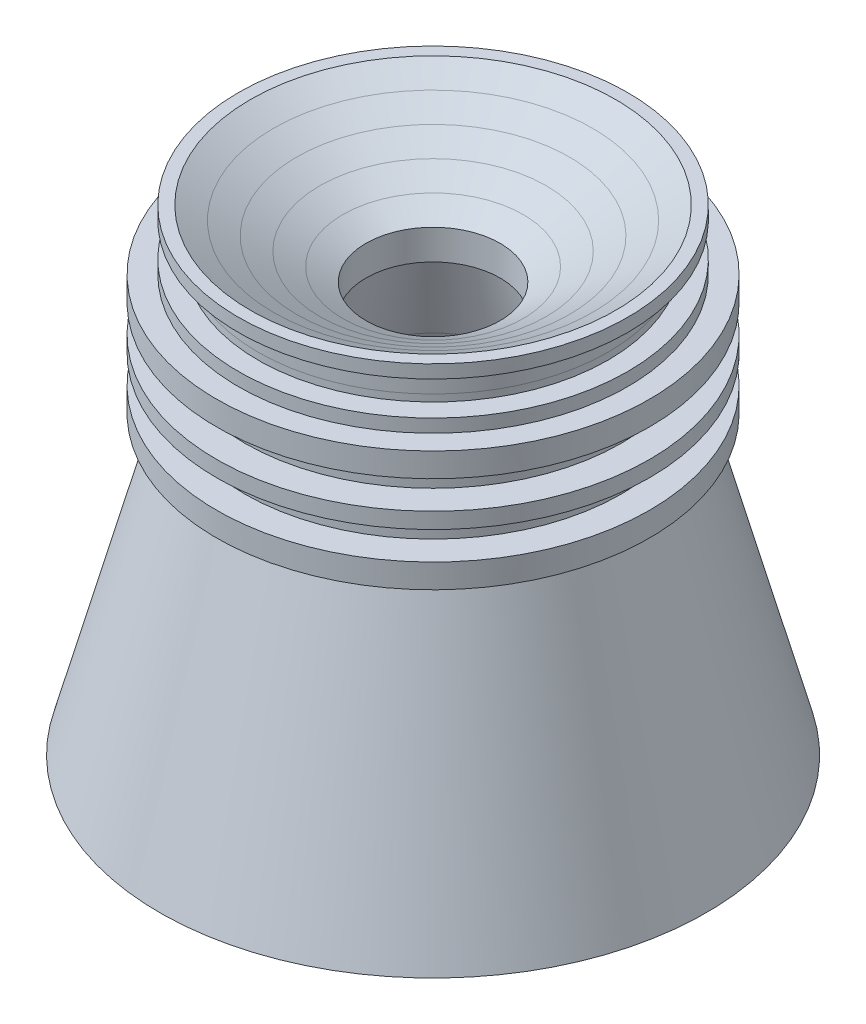
ISO-10303-21;
HEADER;
FILE_DESCRIPTION(('STEP AP214'),'2;1');
FILE_NAME('part.step','',(''),(''),'','','');
FILE_SCHEMA(('AUTOMOTIVE_DESIGN { 1 0 10303 214 1 1 1 1 }'));
ENDSEC;
DATA;
#1=APPLICATION_CONTEXT('core data for automotive mechanical design processes');
#2=APPLICATION_PROTOCOL_DEFINITION('international standard','automotive_design',2000,#1);
#3=PRODUCT_CONTEXT('',#1,'mechanical');
#4=PRODUCT('Part','Part','',(#3));
#5=PRODUCT_RELATED_PRODUCT_CATEGORY('part','',(#4));
#6=PRODUCT_DEFINITION_FORMATION('','',#4);
#7=PRODUCT_DEFINITION_CONTEXT('part definition',#1,'design');
#8=PRODUCT_DEFINITION('design','',#6,#7);
#9=PRODUCT_DEFINITION_SHAPE('','',#8);
#10=(LENGTH_UNIT() NAMED_UNIT(*) SI_UNIT(.MILLI.,.METRE.));
#11=(NAMED_UNIT(*) PLANE_ANGLE_UNIT() SI_UNIT($,.RADIAN.));
#12=(NAMED_UNIT(*) SI_UNIT($,.STERADIAN.) SOLID_ANGLE_UNIT());
#13=UNCERTAINTY_MEASURE_WITH_UNIT(LENGTH_MEASURE(1.E-05),#10,'distance_accuracy_value','');
#14=(GEOMETRIC_REPRESENTATION_CONTEXT(3) GLOBAL_UNCERTAINTY_ASSIGNED_CONTEXT((#13)) GLOBAL_UNIT_ASSIGNED_CONTEXT((#10,
#11,#12)) REPRESENTATION_CONTEXT('',''));
#15=CARTESIAN_POINT('',(0.,0.,0.));
#16=DIRECTION('',(0.,0.,1.));
#17=DIRECTION('',(1.,0.,0.));
#18=AXIS2_PLACEMENT_3D('',#15,#16,#17);
#19=CARTESIAN_POINT('',(0.,29.8728472820934,0.));
#20=DIRECTION('',(0.,-1.,0.));
#21=DIRECTION('',(1.,0.,0.));
#22=AXIS2_PLACEMENT_3D('',#19,#20,#21);
#23=CONICAL_SURFACE('',#22,14.1732,0.26179938779915);
#24=CARTESIAN_POINT('',(0.,-50.3229532912695,0.));
#25=DIRECTION('',(0.,1.,0.));
#26=DIRECTION('',(-1.,0.,0.));
#27=AXIS2_PLACEMENT_3D('',#24,#25,#26);
#28=CIRCLE('',#27,35.6616);
#29=CARTESIAN_POINT('',(-35.6616,-50.3229532912695,0.));
#30=VERTEX_POINT('',#29);
#31=EDGE_CURVE('E101',#30,#30,#28,.T.);
#32=ORIENTED_EDGE('',*,*,#31,.F.);
#33=EDGE_LOOP('',(#32));
#34=FACE_BOUND('',#33,.T.);
#35=CARTESIAN_POINT('',(0.,-34.2837262,0.));
#36=DIRECTION('',(0.,1.,0.));
#37=DIRECTION('',(0.,0.,1.));
#38=AXIS2_PLACEMENT_3D('',#35,#36,#37);
#39=CIRCLE('',#38,31.363902053675);
#40=CARTESIAN_POINT('',(0.,-34.2837262,31.363902053675));
#41=VERTEX_POINT('',#40);
#42=EDGE_CURVE('E10',#41,#41,#39,.F.);
#43=ORIENTED_EDGE('',*,*,#42,.F.);
#44=EDGE_LOOP('',(#43));
#45=FACE_BOUND('',#44,.T.);
#46=ADVANCED_FACE('F37',(#34,#45),#23,.F.);
#47=ORIENTED_EDGE('',*,*,#42,.T.);
#48=EDGE_LOOP('',(#47));
#49=FACE_BOUND('',#48,.T.);
#50=CARTESIAN_POINT('',(0.,-18.244566,0.));
#51=DIRECTION('',(0.,1.,0.));
#52=DIRECTION('',(0.,0.,1.));
#53=AXIS2_PLACEMENT_3D('',#50,#51,#52);
#54=CIRCLE('',#53,27.0662220308115);
#55=CARTESIAN_POINT('',(0.,-18.244566,27.0662220308115));
#56=VERTEX_POINT('',#55);
#57=EDGE_CURVE('E45',#56,#56,#54,.F.);
#58=ORIENTED_EDGE('',*,*,#57,.F.);
#59=EDGE_LOOP('',(#58));
#60=FACE_BOUND('',#59,.T.);
#61=ADVANCED_FACE('F181',(#49,#60),#23,.F.);
#62=ORIENTED_EDGE('',*,*,#57,.T.);
#63=EDGE_LOOP('',(#62));
#64=FACE_BOUND('',#63,.T.);
#65=CARTESIAN_POINT('',(0.,-2.2054058,0.));
#66=DIRECTION('',(0.,1.,0.));
#67=DIRECTION('',(0.,0.,1.));
#68=AXIS2_PLACEMENT_3D('',#65,#66,#67);
#69=CIRCLE('',#68,22.7685420079481);
#70=CARTESIAN_POINT('',(0.,-2.2054058,22.7685420079481));
#71=VERTEX_POINT('',#70);
#72=EDGE_CURVE('E52',#71,#71,#69,.F.);
#73=ORIENTED_EDGE('',*,*,#72,.F.);
#74=EDGE_LOOP('',(#73));
#75=FACE_BOUND('',#74,.T.);
#76=ADVANCED_FACE('F188',(#64,#75),#23,.F.);
#77=ORIENTED_EDGE('',*,*,#72,.T.);
#78=EDGE_LOOP('',(#77));
#79=FACE_BOUND('',#78,.T.);
#80=CARTESIAN_POINT('',(0.,13.8337544,0.));
#81=DIRECTION('',(0.,1.,0.));
#82=DIRECTION('',(-1.,0.,0.));
#83=AXIS2_PLACEMENT_3D('',#80,#81,#82);
#84=CIRCLE('',#83,18.4708619850847);
#85=CARTESIAN_POINT('',(-18.4708619850847,13.8337544,0.));
#86=VERTEX_POINT('',#85);
#87=EDGE_CURVE('E59',#86,#86,#84,.F.);
#88=ORIENTED_EDGE('',*,*,#87,.F.);
#89=EDGE_LOOP('',(#88));
#90=FACE_BOUND('',#89,.T.);
#91=ADVANCED_FACE('F196',(#79,#90),#23,.F.);
#92=CARTESIAN_POINT('',(0.,50.3229532912695,0.));
#93=DIRECTION('',(0.,1.,0.));
#94=DIRECTION('',(-1.,0.,0.));
#95=AXIS2_PLACEMENT_3D('',#92,#93,#94);
#96=CONICAL_SURFACE('',#95,38.5953,1.04719755119659);
#97=CARTESIAN_POINT('',(0.,36.2228472820934,0.));
#98=DIRECTION('',(0.,1.,0.));
#99=DIRECTION('',(-1.,0.,0.));
#100=AXIS2_PLACEMENT_3D('',#97,#98,#99);
#101=CIRCLE('',#100,14.1732);
#102=CARTESIAN_POINT('',(-14.1732,36.2228472820934,0.));
#103=VERTEX_POINT('',#102);
#104=EDGE_CURVE('E95',#103,#103,#101,.T.);
#105=ORIENTED_EDGE('',*,*,#104,.F.);
#106=EDGE_LOOP('',(#105));
#107=FACE_BOUND('',#106,.T.);
#108=CARTESIAN_POINT('',(0.,39.0429148912695,0.));
#109=DIRECTION('',(0.,1.,0.));
#110=DIRECTION('',(0.,0.,1.));
#111=AXIS2_PLACEMENT_3D('',#108,#109,#110);
#112=CIRCLE('',#111,19.0577003798722);
#113=CARTESIAN_POINT('',(0.,39.0429148912695,19.0577003798722));
#114=VERTEX_POINT('',#113);
#115=EDGE_CURVE('E65',#114,#114,#112,.F.);
#116=ORIENTED_EDGE('',*,*,#115,.F.);
#117=EDGE_LOOP('',(#116));
#118=FACE_BOUND('',#117,.T.);
#119=ADVANCED_FACE('F177',(#107,#118),#96,.F.);
#120=CARTESIAN_POINT('',(0.,37.6229532912695,0.));
#121=DIRECTION('',(0.,-1.,0.));
#122=DIRECTION('',(1.,0.,0.));
#123=AXIS2_PLACEMENT_3D('',#120,#121,#122);
#124=CYLINDRICAL_SURFACE('',#123,36.9824);
#125=CARTESIAN_POINT('',(0.,40.4042532912695,0.));
#126=DIRECTION('',(0.,-1.,0.));
#127=DIRECTION('',(1.,0.,0.));
#128=AXIS2_PLACEMENT_3D('',#125,#126,#127);
#129=CIRCLE('',#128,36.9824);
#130=CARTESIAN_POINT('',(36.9824,40.4042532912695,0.));
#131=VERTEX_POINT('',#130);
#132=EDGE_CURVE('E150',#131,#131,#129,.T.);
#133=ORIENTED_EDGE('',*,*,#132,.F.);
#134=EDGE_LOOP('',(#133));
#135=FACE_BOUND('',#134,.T.);
#136=CARTESIAN_POINT('',(0.,41.8629244912695,0.));
#137=DIRECTION('',(0.,1.,0.));
#138=DIRECTION('',(0.,0.,1.));
#139=AXIS2_PLACEMENT_3D('',#136,#137,#138);
#140=CIRCLE('',#139,36.9824);
#141=CARTESIAN_POINT('',(0.,41.8629244912695,36.9824));
#142=VERTEX_POINT('',#141);
#143=EDGE_CURVE('E69',#142,#142,#140,.T.);
#144=ORIENTED_EDGE('',*,*,#143,.F.);
#145=EDGE_LOOP('',(#144));
#146=FACE_BOUND('',#145,.T.);
#147=ADVANCED_FACE('F211',(#135,#146),#124,.T.);
#148=ORIENTED_EDGE('',*,*,#115,.T.);
#149=EDGE_LOOP('',(#148));
#150=FACE_BOUND('',#149,.T.);
#151=CARTESIAN_POINT('',(0.,41.8629244912695,0.));
#152=DIRECTION('',(0.,1.,0.));
#153=DIRECTION('',(0.,0.,1.));
#154=AXIS2_PLACEMENT_3D('',#151,#152,#153);
#155=CIRCLE('',#154,23.9421002849042);
#156=CARTESIAN_POINT('',(0.,41.8629244912695,23.9421002849042));
#157=VERTEX_POINT('',#156);
#158=EDGE_CURVE('E70',#157,#157,#155,.F.);
#159=ORIENTED_EDGE('',*,*,#158,.F.);
#160=EDGE_LOOP('',(#159));
#161=FACE_BOUND('',#160,.T.);
#162=ADVANCED_FACE('F213',(#150,#161),#96,.F.);
#163=ORIENTED_EDGE('',*,*,#143,.T.);
#164=EDGE_LOOP('',(#163));
#165=FACE_BOUND('',#164,.T.);
#166=CARTESIAN_POINT('',(0.,44.6829340912695,0.));
#167=DIRECTION('',(0.,1.,0.));
#168=DIRECTION('',(0.,0.,1.));
#169=AXIS2_PLACEMENT_3D('',#166,#167,#168);
#170=CIRCLE('',#169,36.9824);
#171=CARTESIAN_POINT('',(0.,44.6829340912695,36.9824));
#172=VERTEX_POINT('',#171);
#173=EDGE_CURVE('E74',#172,#172,#170,.T.);
#174=ORIENTED_EDGE('',*,*,#173,.F.);
#175=EDGE_LOOP('',(#174));
#176=FACE_BOUND('',#175,.T.);
#177=ADVANCED_FACE('F267',(#165,#176),#124,.T.);
#178=ORIENTED_EDGE('',*,*,#158,.T.);
#179=EDGE_LOOP('',(#178));
#180=FACE_BOUND('',#179,.T.);
#181=CARTESIAN_POINT('',(0.,44.6829340912695,0.));
#182=DIRECTION('',(0.,1.,0.));
#183=DIRECTION('',(0.,0.,1.));
#184=AXIS2_PLACEMENT_3D('',#181,#182,#183);
#185=CIRCLE('',#184,28.8265001899361);
#186=CARTESIAN_POINT('',(0.,44.6829340912695,28.8265001899361));
#187=VERTEX_POINT('',#186);
#188=EDGE_CURVE('E78',#187,#187,#185,.F.);
#189=ORIENTED_EDGE('',*,*,#188,.F.);
#190=EDGE_LOOP('',(#189));
#191=FACE_BOUND('',#190,.T.);
#192=ADVANCED_FACE('F278',(#180,#191),#96,.F.);
#193=ORIENTED_EDGE('',*,*,#188,.T.);
#194=EDGE_LOOP('',(#193));
#195=FACE_BOUND('',#194,.T.);
#196=CARTESIAN_POINT('',(0.,47.5029436912695,0.));
#197=DIRECTION('',(0.,1.,0.));
#198=DIRECTION('',(0.,0.,1.));
#199=AXIS2_PLACEMENT_3D('',#196,#197,#198);
#200=CIRCLE('',#199,33.7109000949681);
#201=CARTESIAN_POINT('',(0.,47.5029436912695,33.7109000949681));
#202=VERTEX_POINT('',#201);
#203=EDGE_CURVE('E82',#202,#202,#200,.F.);
#204=ORIENTED_EDGE('',*,*,#203,.F.);
#205=EDGE_LOOP('',(#204));
#206=FACE_BOUND('',#205,.T.);
#207=ADVANCED_FACE('F178',(#195,#206),#96,.F.);
#208=CARTESIAN_POINT('',(0.,50.3229532912695,0.));
#209=DIRECTION('',(0.,1.,0.));
#210=DIRECTION('',(-1.,0.,0.));
#211=AXIS2_PLACEMENT_3D('',#208,#209,#210);
#212=CYLINDRICAL_SURFACE('',#211,45.7326999999999);
#213=CARTESIAN_POINT('',(0.,12.2229532912695,0.));
#214=DIRECTION('',(0.,1.,0.));
#215=DIRECTION('',(-1.,0.,0.));
#216=AXIS2_PLACEMENT_3D('',#213,#214,#215);
#217=CIRCLE('',#216,45.7326999999999);
#218=CARTESIAN_POINT('',(-45.7326999999999,12.2229532912695,0.));
#219=VERTEX_POINT('',#218);
#220=EDGE_CURVE('E113',#219,#219,#217,.T.);
#221=ORIENTED_EDGE('',*,*,#220,.T.);
#222=EDGE_LOOP('',(#221));
#223=FACE_BOUND('',#222,.T.);
#224=CARTESIAN_POINT('',(0.,17.3029532912695,0.));
#225=DIRECTION('',(0.,-1.,0.));
#226=DIRECTION('',(1.,0.,0.));
#227=AXIS2_PLACEMENT_3D('',#224,#225,#226);
#228=CIRCLE('',#227,45.7326999999999);
#229=CARTESIAN_POINT('',(45.7326999999999,17.3029532912695,0.));
#230=VERTEX_POINT('',#229);
#231=EDGE_CURVE('E133',#230,#230,#228,.T.);
#232=ORIENTED_EDGE('',*,*,#231,.T.);
#233=EDGE_LOOP('',(#232));
#234=FACE_BOUND('',#233,.T.);
#235=ADVANCED_FACE('F164',(#223,#234),#212,.T.);
#236=CARTESIAN_POINT('',(0.,50.3229532912695,0.));
#237=DIRECTION('',(0.,1.,0.));
#238=DIRECTION('',(-1.,0.,0.));
#239=AXIS2_PLACEMENT_3D('',#236,#237,#238);
#240=CYLINDRICAL_SURFACE('',#239,41.1353);
#241=CARTESIAN_POINT('',(0.,47.5416532912695,0.));
#242=DIRECTION('',(0.,-1.,0.));
#243=DIRECTION('',(1.,0.,0.));
#244=AXIS2_PLACEMENT_3D('',#241,#242,#243);
#245=CIRCLE('',#244,41.1353);
#246=CARTESIAN_POINT('',(41.1353,47.5416532912695,0.));
#247=VERTEX_POINT('',#246);
#248=EDGE_CURVE('E139',#247,#247,#245,.T.);
#249=ORIENTED_EDGE('',*,*,#248,.F.);
#250=EDGE_LOOP('',(#249));
#251=FACE_BOUND('',#250,.T.);
#252=CARTESIAN_POINT('',(0.,50.3229532912695,0.));
#253=DIRECTION('',(0.,1.,0.));
#254=DIRECTION('',(-1.,0.,0.));
#255=AXIS2_PLACEMENT_3D('',#252,#253,#254);
#256=CIRCLE('',#255,41.1353);
#257=CARTESIAN_POINT('',(-41.1353,50.3229532912695,0.));
#258=VERTEX_POINT('',#257);
#259=EDGE_CURVE('E89',#258,#258,#256,.T.);
#260=ORIENTED_EDGE('',*,*,#259,.F.);
#261=EDGE_LOOP('',(#260));
#262=FACE_BOUND('',#261,.T.);
#263=ADVANCED_FACE('F39',(#251,#262),#240,.T.);
#264=CARTESIAN_POINT('',(41.1353,50.3229532912695,0.));
#265=DIRECTION('',(0.,-1.,0.));
#266=DIRECTION('',(1.,0.,0.));
#267=AXIS2_PLACEMENT_3D('',#264,#265,#266);
#268=PLANE('',#267);
#269=CARTESIAN_POINT('',(0.,50.3229532912695,0.));
#270=DIRECTION('',(0.,1.,0.));
#271=DIRECTION('',(-1.,0.,0.));
#272=AXIS2_PLACEMENT_3D('',#269,#270,#271);
#273=CIRCLE('',#272,38.5953);
#274=CARTESIAN_POINT('',(-38.5953,50.3229532912695,0.));
#275=VERTEX_POINT('',#274);
#276=EDGE_CURVE('E92',#275,#275,#273,.T.);
#277=ORIENTED_EDGE('',*,*,#276,.F.);
#278=EDGE_LOOP('',(#277));
#279=FACE_BOUND('',#278,.T.);
#280=ORIENTED_EDGE('',*,*,#259,.T.);
#281=EDGE_LOOP('',(#280));
#282=FACE_BOUND('',#281,.T.);
#283=ADVANCED_FACE('F163',(#279,#282),#268,.F.);
#284=ORIENTED_EDGE('',*,*,#203,.T.);
#285=EDGE_LOOP('',(#284));
#286=FACE_BOUND('',#285,.T.);
#287=ORIENTED_EDGE('',*,*,#276,.T.);
#288=EDGE_LOOP('',(#287));
#289=FACE_BOUND('',#288,.T.);
#290=ADVANCED_FACE('F169',(#286,#289),#96,.F.);
#291=CARTESIAN_POINT('',(0.,50.3229532912695,0.));
#292=DIRECTION('',(0.,1.,0.));
#293=DIRECTION('',(-1.,0.,0.));
#294=AXIS2_PLACEMENT_3D('',#291,#292,#293);
#295=CYLINDRICAL_SURFACE('',#294,14.1732);
#296=CARTESIAN_POINT('',(0.,29.8728472820934,0.));
#297=DIRECTION('',(0.,1.,0.));
#298=DIRECTION('',(-1.,0.,0.));
#299=AXIS2_PLACEMENT_3D('',#296,#297,#298);
#300=CIRCLE('',#299,14.1732);
#301=CARTESIAN_POINT('',(-14.1732,29.8728472820934,0.));
#302=VERTEX_POINT('',#301);
#303=EDGE_CURVE('E98',#302,#302,#300,.T.);
#304=ORIENTED_EDGE('',*,*,#303,.F.);
#305=EDGE_LOOP('',(#304));
#306=FACE_BOUND('',#305,.T.);
#307=ORIENTED_EDGE('',*,*,#104,.T.);
#308=EDGE_LOOP('',(#307));
#309=FACE_BOUND('',#308,.T.);
#310=ADVANCED_FACE('F174',(#306,#309),#295,.F.);
#311=ORIENTED_EDGE('',*,*,#87,.T.);
#312=EDGE_LOOP('',(#311));
#313=FACE_BOUND('',#312,.T.);
#314=ORIENTED_EDGE('',*,*,#303,.T.);
#315=EDGE_LOOP('',(#314));
#316=FACE_BOUND('',#315,.T.);
#317=ADVANCED_FACE('F184',(#313,#316),#23,.F.);
#318=CARTESIAN_POINT('',(57.7596,-50.3229532912695,0.));
#319=DIRECTION('',(0.,1.,0.));
#320=DIRECTION('',(-1.,0.,0.));
#321=AXIS2_PLACEMENT_3D('',#318,#319,#320);
#322=PLANE('',#321);
#323=CARTESIAN_POINT('',(0.,-50.3229532912695,0.));
#324=DIRECTION('',(0.,1.,0.));
#325=DIRECTION('',(-1.,0.,0.));
#326=AXIS2_PLACEMENT_3D('',#323,#324,#325);
#327=CIRCLE('',#326,57.7596);
#328=CARTESIAN_POINT('',(-57.7596,-50.3229532912695,0.));
#329=VERTEX_POINT('',#328);
#330=EDGE_CURVE('E104',#329,#329,#327,.T.);
#331=ORIENTED_EDGE('',*,*,#330,.F.);
#332=EDGE_LOOP('',(#331));
#333=FACE_BOUND('',#332,.T.);
#334=ORIENTED_EDGE('',*,*,#31,.T.);
#335=EDGE_LOOP('',(#334));
#336=FACE_BOUND('',#335,.T.);
#337=ADVANCED_FACE('F194',(#333,#336),#322,.F.);
#338=CARTESIAN_POINT('',(0.,-50.3229532912695,0.));
#339=DIRECTION('',(0.,-1.,0.));
#340=DIRECTION('',(1.,0.,0.));
#341=AXIS2_PLACEMENT_3D('',#338,#339,#340);
#342=CONICAL_SURFACE('',#341,57.7596,0.26179938779915);
#343=CARTESIAN_POINT('',(0.,11.9713661201337,0.));
#344=DIRECTION('',(0.,1.,0.));
#345=DIRECTION('',(-1.,0.,0.));
#346=AXIS2_PLACEMENT_3D('',#343,#344,#345);
#347=CIRCLE('',#346,41.0678874206681);
#348=CARTESIAN_POINT('',(-41.0678874206681,11.9713661201337,0.));
#349=VERTEX_POINT('',#348);
#350=EDGE_CURVE('E107',#349,#349,#347,.T.);
#351=ORIENTED_EDGE('',*,*,#350,.F.);
#352=EDGE_LOOP('',(#351));
#353=FACE_BOUND('',#352,.T.);
#354=ORIENTED_EDGE('',*,*,#330,.T.);
#355=EDGE_LOOP('',(#354));
#356=FACE_BOUND('',#355,.T.);
#357=ADVANCED_FACE('F201',(#353,#356),#342,.T.);
#358=CARTESIAN_POINT('',(0.,11.9713661201337,0.));
#359=DIRECTION('',(0.,1.,0.));
#360=DIRECTION('',(-1.,0.,0.));
#361=AXIS2_PLACEMENT_3D('',#358,#359,#360);
#362=CONICAL_SURFACE('',#361,41.0678874206681,0.261799387799139);
#363=CARTESIAN_POINT('',(0.,12.2229532912695,0.));
#364=DIRECTION('',(0.,1.,0.));
#365=DIRECTION('',(-1.,0.,0.));
#366=AXIS2_PLACEMENT_3D('',#363,#364,#365);
#367=CIRCLE('',#366,41.1352999999999);
#368=CARTESIAN_POINT('',(-41.1352999999999,12.2229532912695,0.));
#369=VERTEX_POINT('',#368);
#370=EDGE_CURVE('E110',#369,#369,#367,.T.);
#371=ORIENTED_EDGE('',*,*,#370,.F.);
#372=EDGE_LOOP('',(#371));
#373=FACE_BOUND('',#372,.T.);
#374=ORIENTED_EDGE('',*,*,#350,.T.);
#375=EDGE_LOOP('',(#374));
#376=FACE_BOUND('',#375,.T.);
#377=ADVANCED_FACE('F447',(#373,#376),#362,.T.);
#378=CARTESIAN_POINT('',(41.1352999999999,12.2229532912695,0.));
#379=DIRECTION('',(0.,1.,0.));
#380=DIRECTION('',(-1.,0.,0.));
#381=AXIS2_PLACEMENT_3D('',#378,#379,#380);
#382=PLANE('',#381);
#383=ORIENTED_EDGE('',*,*,#220,.F.);
#384=EDGE_LOOP('',(#383));
#385=FACE_BOUND('',#384,.T.);
#386=ORIENTED_EDGE('',*,*,#370,.T.);
#387=EDGE_LOOP('',(#386));
#388=FACE_BOUND('',#387,.T.);
#389=ADVANCED_FACE('F389',(#385,#388),#382,.F.);
#390=CARTESIAN_POINT('',(45.7326999999999,17.3029532912695,0.));
#391=DIRECTION('',(0.,1.,0.));
#392=DIRECTION('',(-1.,0.,0.));
#393=AXIS2_PLACEMENT_3D('',#390,#391,#392);
#394=PLANE('',#393);
#395=CARTESIAN_POINT('',(0.,17.3029532912695,0.));
#396=DIRECTION('',(0.,-1.,0.));
#397=DIRECTION('',(1.,0.,0.));
#398=AXIS2_PLACEMENT_3D('',#395,#396,#397);
#399=CIRCLE('',#398,39.7915262033108);
#400=CARTESIAN_POINT('',(39.7915262033108,17.3029532912695,0.));
#401=VERTEX_POINT('',#400);
#402=EDGE_CURVE('E130',#401,#401,#399,.T.);
#403=ORIENTED_EDGE('',*,*,#402,.T.);
#404=EDGE_LOOP('',(#403));
#405=FACE_BOUND('',#404,.T.);
#406=ORIENTED_EDGE('',*,*,#231,.F.);
#407=EDGE_LOOP('',(#406));
#408=FACE_BOUND('',#407,.T.);
#409=ADVANCED_FACE('F379',(#405,#408),#394,.T.);
#410=CARTESIAN_POINT('',(0.,37.6229532912695,0.));
#411=DIRECTION('',(0.,-1.,0.));
#412=DIRECTION('',(1.,0.,0.));
#413=AXIS2_PLACEMENT_3D('',#410,#411,#412);
#414=CYLINDRICAL_SURFACE('',#413,39.7915262033108);
#415=ORIENTED_EDGE('',*,*,#402,.F.);
#416=EDGE_LOOP('',(#415));
#417=FACE_BOUND('',#416,.T.);
#418=CARTESIAN_POINT('',(0.,23.2441270879586,0.));
#419=DIRECTION('',(0.,-1.,0.));
#420=DIRECTION('',(1.,0.,0.));
#421=AXIS2_PLACEMENT_3D('',#418,#419,#420);
#422=CIRCLE('',#421,39.7915262033108);
#423=CARTESIAN_POINT('',(39.7915262033108,23.2441270879586,0.));
#424=VERTEX_POINT('',#423);
#425=EDGE_CURVE('E127',#424,#424,#422,.T.);
#426=ORIENTED_EDGE('',*,*,#425,.T.);
#427=EDGE_LOOP('',(#426));
#428=FACE_BOUND('',#427,.T.);
#429=ADVANCED_FACE('F369',(#417,#428),#414,.T.);
#430=CARTESIAN_POINT('',(45.7326999999999,23.2441270879586,0.));
#431=DIRECTION('',(0.,1.,0.));
#432=DIRECTION('',(-1.,0.,0.));
#433=AXIS2_PLACEMENT_3D('',#430,#431,#432);
#434=PLANE('',#433);
#435=ORIENTED_EDGE('',*,*,#425,.F.);
#436=EDGE_LOOP('',(#435));
#437=FACE_BOUND('',#436,.T.);
#438=CARTESIAN_POINT('',(0.,23.2441270879586,0.));
#439=DIRECTION('',(0.,-1.,0.));
#440=DIRECTION('',(1.,0.,0.));
#441=AXIS2_PLACEMENT_3D('',#438,#439,#440);
#442=CIRCLE('',#441,45.7326999999999);
#443=CARTESIAN_POINT('',(45.7326999999999,23.2441270879586,0.));
#444=VERTEX_POINT('',#443);
#445=EDGE_CURVE('E123',#444,#444,#442,.T.);
#446=ORIENTED_EDGE('',*,*,#445,.T.);
#447=EDGE_LOOP('',(#446));
#448=FACE_BOUND('',#447,.T.);
#449=ADVANCED_FACE('F359',(#437,#448),#434,.F.);
#450=CARTESIAN_POINT('',(0.,47.5416532912695,0.));
#451=DIRECTION('',(0.,1.,0.));
#452=DIRECTION('',(-1.,0.,0.));
#453=AXIS2_PLACEMENT_3D('',#450,#451,#452);
#454=PLANE('',#453);
#455=CARTESIAN_POINT('',(0.,47.5416532912695,0.));
#456=DIRECTION('',(0.,-1.,0.));
#457=DIRECTION('',(1.,0.,0.));
#458=AXIS2_PLACEMENT_3D('',#455,#456,#457);
#459=CIRCLE('',#458,36.9824);
#460=CARTESIAN_POINT('',(36.9824,47.5416532912695,0.));
#461=VERTEX_POINT('',#460);
#462=EDGE_CURVE('E122',#461,#461,#459,.T.);
#463=ORIENTED_EDGE('',*,*,#462,.F.);
#464=EDGE_LOOP('',(#463));
#465=FACE_BOUND('',#464,.T.);
#466=ORIENTED_EDGE('',*,*,#248,.T.);
#467=EDGE_LOOP('',(#466));
#468=FACE_BOUND('',#467,.T.);
#469=ADVANCED_FACE('F159',(#465,#468),#454,.F.);
#470=ORIENTED_EDGE('',*,*,#173,.T.);
#471=EDGE_LOOP('',(#470));
#472=FACE_BOUND('',#471,.T.);
#473=ORIENTED_EDGE('',*,*,#462,.T.);
#474=EDGE_LOOP('',(#473));
#475=FACE_BOUND('',#474,.T.);
#476=ADVANCED_FACE('F268',(#472,#475),#124,.T.);
#477=CARTESIAN_POINT('',(0.,40.4042532912695,0.));
#478=DIRECTION('',(0.,1.,0.));
#479=DIRECTION('',(-1.,0.,0.));
#480=AXIS2_PLACEMENT_3D('',#477,#478,#479);
#481=PLANE('',#480);
#482=ORIENTED_EDGE('',*,*,#132,.T.);
#483=EDGE_LOOP('',(#482));
#484=FACE_BOUND('',#483,.T.);
#485=CARTESIAN_POINT('',(0.,40.4042532912695,0.));
#486=DIRECTION('',(0.,-1.,0.));
#487=DIRECTION('',(1.,0.,0.));
#488=AXIS2_PLACEMENT_3D('',#485,#486,#487);
#489=CIRCLE('',#488,41.1353);
#490=CARTESIAN_POINT('',(41.1353,40.4042532912695,0.));
#491=VERTEX_POINT('',#490);
#492=EDGE_CURVE('E153',#491,#491,#489,.T.);
#493=ORIENTED_EDGE('',*,*,#492,.F.);
#494=EDGE_LOOP('',(#493));
#495=FACE_BOUND('',#494,.T.);
#496=ADVANCED_FACE('F340',(#484,#495),#481,.T.);
#497=ORIENTED_EDGE('',*,*,#445,.F.);
#498=EDGE_LOOP('',(#497));
#499=FACE_BOUND('',#498,.T.);
#500=CARTESIAN_POINT('',(0.,26.6017794945803,0.));
#501=DIRECTION('',(0.,-1.,0.));
#502=DIRECTION('',(1.,0.,0.));
#503=AXIS2_PLACEMENT_3D('',#500,#501,#502);
#504=CIRCLE('',#503,45.7327);
#505=CARTESIAN_POINT('',(45.7327,26.6017794945803,0.));
#506=VERTEX_POINT('',#505);
#507=EDGE_CURVE('E140',#506,#506,#504,.T.);
#508=ORIENTED_EDGE('',*,*,#507,.T.);
#509=EDGE_LOOP('',(#508));
#510=FACE_BOUND('',#509,.T.);
#511=ADVANCED_FACE('F334',(#499,#510),#212,.T.);
#512=CARTESIAN_POINT('',(0.,32.5429532912695,0.));
#513=DIRECTION('',(0.,1.,0.));
#514=DIRECTION('',(-1.,0.,0.));
#515=AXIS2_PLACEMENT_3D('',#512,#513,#514);
#516=PLANE('',#515);
#517=CARTESIAN_POINT('',(0.,32.5429532912695,0.));
#518=DIRECTION('',(0.,-1.,0.));
#519=DIRECTION('',(1.,0.,0.));
#520=AXIS2_PLACEMENT_3D('',#517,#518,#519);
#521=CIRCLE('',#520,39.7915262033108);
#522=CARTESIAN_POINT('',(39.7915262033108,32.5429532912695,0.));
#523=VERTEX_POINT('',#522);
#524=EDGE_CURVE('E126',#523,#523,#521,.T.);
#525=ORIENTED_EDGE('',*,*,#524,.F.);
#526=EDGE_LOOP('',(#525));
#527=FACE_BOUND('',#526,.T.);
#528=CARTESIAN_POINT('',(0.,32.5429532912695,0.));
#529=DIRECTION('',(0.,-1.,0.));
#530=DIRECTION('',(1.,0.,0.));
#531=AXIS2_PLACEMENT_3D('',#528,#529,#530);
#532=CIRCLE('',#531,45.7326999999999);
#533=CARTESIAN_POINT('',(45.7326999999999,32.5429532912695,0.));
#534=VERTEX_POINT('',#533);
#535=EDGE_CURVE('E136',#534,#534,#532,.T.);
#536=ORIENTED_EDGE('',*,*,#535,.T.);
#537=EDGE_LOOP('',(#536));
#538=FACE_BOUND('',#537,.T.);
#539=ADVANCED_FACE('F324',(#527,#538),#516,.F.);
#540=CARTESIAN_POINT('',(0.,26.6017794945803,0.));
#541=DIRECTION('',(0.,1.,0.));
#542=DIRECTION('',(-1.,0.,0.));
#543=AXIS2_PLACEMENT_3D('',#540,#541,#542);
#544=PLANE('',#543);
#545=CARTESIAN_POINT('',(0.,26.6017794945803,0.));
#546=DIRECTION('',(0.,-1.,0.));
#547=DIRECTION('',(1.,0.,0.));
#548=AXIS2_PLACEMENT_3D('',#545,#546,#547);
#549=CIRCLE('',#548,39.7915262033108);
#550=CARTESIAN_POINT('',(39.7915262033108,26.6017794945803,0.));
#551=VERTEX_POINT('',#550);
#552=EDGE_CURVE('E143',#551,#551,#549,.T.);
#553=ORIENTED_EDGE('',*,*,#552,.T.);
#554=EDGE_LOOP('',(#553));
#555=FACE_BOUND('',#554,.T.);
#556=ORIENTED_EDGE('',*,*,#507,.F.);
#557=EDGE_LOOP('',(#556));
#558=FACE_BOUND('',#557,.T.);
#559=ADVANCED_FACE('F313',(#555,#558),#544,.T.);
#560=CARTESIAN_POINT('',(0.,37.6229532912695,0.));
#561=DIRECTION('',(0.,-1.,0.));
#562=DIRECTION('',(1.,0.,0.));
#563=AXIS2_PLACEMENT_3D('',#560,#561,#562);
#564=CYLINDRICAL_SURFACE('',#563,39.7915262033108);
#565=ORIENTED_EDGE('',*,*,#552,.F.);
#566=EDGE_LOOP('',(#565));
#567=FACE_BOUND('',#566,.T.);
#568=ORIENTED_EDGE('',*,*,#524,.T.);
#569=EDGE_LOOP('',(#568));
#570=FACE_BOUND('',#569,.T.);
#571=ADVANCED_FACE('F308',(#567,#570),#564,.T.);
#572=CARTESIAN_POINT('',(0.,37.6229532912695,0.));
#573=DIRECTION('',(0.,1.,0.));
#574=DIRECTION('',(-1.,0.,0.));
#575=AXIS2_PLACEMENT_3D('',#572,#573,#574);
#576=CIRCLE('',#575,41.1352999999999);
#577=CARTESIAN_POINT('',(-41.1352999999999,37.6229532912695,0.));
#578=VERTEX_POINT('',#577);
#579=EDGE_CURVE('E119',#578,#578,#576,.T.);
#580=ORIENTED_EDGE('',*,*,#579,.T.);
#581=EDGE_LOOP('',(#580));
#582=FACE_BOUND('',#581,.T.);
#583=ORIENTED_EDGE('',*,*,#492,.T.);
#584=EDGE_LOOP('',(#583));
#585=FACE_BOUND('',#584,.T.);
#586=ADVANCED_FACE('F165',(#582,#585),#240,.T.);
#587=CARTESIAN_POINT('',(45.7326999999999,37.6229532912695,0.));
#588=DIRECTION('',(0.,-1.,0.));
#589=DIRECTION('',(1.,0.,0.));
#590=AXIS2_PLACEMENT_3D('',#587,#588,#589);
#591=PLANE('',#590);
#592=ORIENTED_EDGE('',*,*,#579,.F.);
#593=EDGE_LOOP('',(#592));
#594=FACE_BOUND('',#593,.T.);
#595=CARTESIAN_POINT('',(0.,37.6229532912695,0.));
#596=DIRECTION('',(0.,1.,0.));
#597=DIRECTION('',(-1.,0.,0.));
#598=AXIS2_PLACEMENT_3D('',#595,#596,#597);
#599=CIRCLE('',#598,45.7326999999999);
#600=CARTESIAN_POINT('',(-45.7326999999999,37.6229532912695,0.));
#601=VERTEX_POINT('',#600);
#602=EDGE_CURVE('E116',#601,#601,#599,.T.);
#603=ORIENTED_EDGE('',*,*,#602,.T.);
#604=EDGE_LOOP('',(#603));
#605=FACE_BOUND('',#604,.T.);
#606=ADVANCED_FACE('F400',(#594,#605),#591,.F.);
#607=ORIENTED_EDGE('',*,*,#535,.F.);
#608=EDGE_LOOP('',(#607));
#609=FACE_BOUND('',#608,.T.);
#610=ORIENTED_EDGE('',*,*,#602,.F.);
#611=EDGE_LOOP('',(#610));
#612=FACE_BOUND('',#611,.T.);
#613=ADVANCED_FACE('F414',(#609,#612),#212,.T.);
#614=CLOSED_SHELL('',(#46,#61,#76,#91,#119,#147,#162,#177,#192,#207,#235,#263,#283,#290,#310,
#317,#337,#357,#377,#389,#409,#429,#449,#469,#476,#496,#511,#539,#559,#571,#586,#606,#613));
#615=MANIFOLD_SOLID_BREP('B2',#614);
#616=ADVANCED_BREP_SHAPE_REPRESENTATION('',(#18,#615),#14);
#617=SHAPE_DEFINITION_REPRESENTATION(#9,#616);
ENDSEC;
END-ISO-10303-21;
